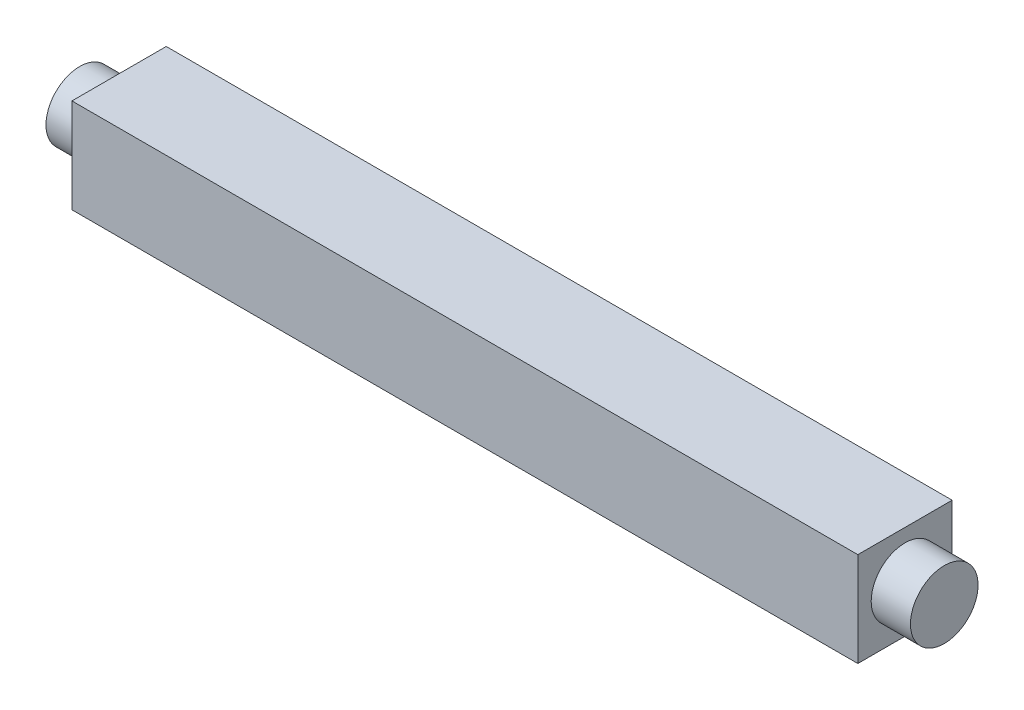
ISO-10303-21;
HEADER;
FILE_DESCRIPTION(('STEP AP214'),'2;1');
FILE_NAME('part.step','',(''),(''),'','','');
FILE_SCHEMA(('AUTOMOTIVE_DESIGN { 1 0 10303 214 1 1 1 1 }'));
ENDSEC;
DATA;
#1=APPLICATION_CONTEXT('core data for automotive mechanical design processes');
#2=APPLICATION_PROTOCOL_DEFINITION('international standard','automotive_design',2000,#1);
#3=PRODUCT_CONTEXT('',#1,'mechanical');
#4=PRODUCT('Part','Part','',(#3));
#5=PRODUCT_RELATED_PRODUCT_CATEGORY('part','',(#4));
#6=PRODUCT_DEFINITION_FORMATION('','',#4);
#7=PRODUCT_DEFINITION_CONTEXT('part definition',#1,'design');
#8=PRODUCT_DEFINITION('design','',#6,#7);
#9=PRODUCT_DEFINITION_SHAPE('','',#8);
#10=(LENGTH_UNIT() NAMED_UNIT(*) SI_UNIT(.MILLI.,.METRE.));
#11=(NAMED_UNIT(*) PLANE_ANGLE_UNIT() SI_UNIT($,.RADIAN.));
#12=(NAMED_UNIT(*) SI_UNIT($,.STERADIAN.) SOLID_ANGLE_UNIT());
#13=UNCERTAINTY_MEASURE_WITH_UNIT(LENGTH_MEASURE(1.E-05),#10,'distance_accuracy_value','');
#14=(GEOMETRIC_REPRESENTATION_CONTEXT(3) GLOBAL_UNCERTAINTY_ASSIGNED_CONTEXT((#13)) GLOBAL_UNIT_ASSIGNED_CONTEXT((#10,
#11,#12)) REPRESENTATION_CONTEXT('',''));
#15=CARTESIAN_POINT('',(0.,0.,0.));
#16=DIRECTION('',(0.,0.,1.));
#17=DIRECTION('',(1.,0.,0.));
#18=AXIS2_PLACEMENT_3D('',#15,#16,#17);
#19=CARTESIAN_POINT('',(0.,0.,6.));
#20=DIRECTION('',(1.,0.,0.));
#21=DIRECTION('',(0.,0.,-1.));
#22=AXIS2_PLACEMENT_3D('',#19,#20,#21);
#23=PLANE('',#22);
#24=CARTESIAN_POINT('',(0.,3.,3.));
#25=DIRECTION('',(-1.,0.,0.));
#26=DIRECTION('',(0.,0.,1.));
#27=AXIS2_PLACEMENT_3D('',#24,#25,#26);
#28=CIRCLE('',#27,2.15);
#29=CARTESIAN_POINT('',(0.,3.,5.15));
#30=VERTEX_POINT('',#29);
#31=EDGE_CURVE('E11',#30,#30,#28,.T.);
#32=ORIENTED_EDGE('',*,*,#31,.F.);
#33=EDGE_LOOP('',(#32));
#34=FACE_BOUND('',#33,.T.);
#35=DIRECTION('',(0.,-1.,0.));
#36=VECTOR('',#35,1.);
#37=CARTESIAN_POINT('',(0.,0.,0.));
#38=LINE('',#37,#36);
#39=CARTESIAN_POINT('',(0.,6.,0.));
#40=VERTEX_POINT('',#39);
#41=CARTESIAN_POINT('',(0.,0.,0.));
#42=VERTEX_POINT('',#41);
#43=EDGE_CURVE('E110',#40,#42,#38,.T.);
#44=ORIENTED_EDGE('',*,*,#43,.T.);
#45=DIRECTION('',(0.,0.,-1.));
#46=VECTOR('',#45,1.);
#47=CARTESIAN_POINT('',(0.,0.,6.));
#48=LINE('',#47,#46);
#49=CARTESIAN_POINT('',(0.,0.,6.));
#50=VERTEX_POINT('',#49);
#51=EDGE_CURVE('E42',#50,#42,#48,.T.);
#52=ORIENTED_EDGE('',*,*,#51,.F.);
#53=DIRECTION('',(0.,-1.,0.));
#54=VECTOR('',#53,1.);
#55=CARTESIAN_POINT('',(0.,0.,6.));
#56=LINE('',#55,#54);
#57=CARTESIAN_POINT('',(0.,6.,6.));
#58=VERTEX_POINT('',#57);
#59=EDGE_CURVE('E93',#58,#50,#56,.T.);
#60=ORIENTED_EDGE('',*,*,#59,.F.);
#61=DIRECTION('',(0.,0.,-1.));
#62=VECTOR('',#61,1.);
#63=CARTESIAN_POINT('',(0.,6.,6.));
#64=LINE('',#63,#62);
#65=EDGE_CURVE('E106',#58,#40,#64,.T.);
#66=ORIENTED_EDGE('',*,*,#65,.T.);
#67=EDGE_LOOP('',(#44,#52,#60,#66));
#68=FACE_BOUND('',#67,.T.);
#69=ADVANCED_FACE('F39',(#34,#68),#23,.F.);
#70=CARTESIAN_POINT('',(0.,0.,6.));
#71=DIRECTION('',(0.,1.,0.));
#72=DIRECTION('',(0.,0.,1.));
#73=AXIS2_PLACEMENT_3D('',#70,#71,#72);
#74=PLANE('',#73);
#75=DIRECTION('',(1.,0.,0.));
#76=VECTOR('',#75,1.);
#77=CARTESIAN_POINT('',(0.,0.,0.));
#78=LINE('',#77,#76);
#79=CARTESIAN_POINT('',(50.,0.,0.));
#80=VERTEX_POINT('',#79);
#81=EDGE_CURVE('E99',#42,#80,#78,.T.);
#82=ORIENTED_EDGE('',*,*,#81,.T.);
#83=DIRECTION('',(0.,0.,-1.));
#84=VECTOR('',#83,1.);
#85=CARTESIAN_POINT('',(50.,0.,6.));
#86=LINE('',#85,#84);
#87=CARTESIAN_POINT('',(50.,0.,6.));
#88=VERTEX_POINT('',#87);
#89=EDGE_CURVE('E97',#88,#80,#86,.T.);
#90=ORIENTED_EDGE('',*,*,#89,.F.);
#91=DIRECTION('',(1.,0.,0.));
#92=VECTOR('',#91,1.);
#93=CARTESIAN_POINT('',(0.,0.,6.));
#94=LINE('',#93,#92);
#95=EDGE_CURVE('E88',#50,#88,#94,.T.);
#96=ORIENTED_EDGE('',*,*,#95,.F.);
#97=ORIENTED_EDGE('',*,*,#51,.T.);
#98=EDGE_LOOP('',(#82,#90,#96,#97));
#99=FACE_BOUND('',#98,.T.);
#100=ADVANCED_FACE('F98',(#99),#74,.F.);
#101=CARTESIAN_POINT('',(50.,0.,6.));
#102=DIRECTION('',(-1.,0.,0.));
#103=DIRECTION('',(0.,0.,1.));
#104=AXIS2_PLACEMENT_3D('',#101,#102,#103);
#105=PLANE('',#104);
#106=CARTESIAN_POINT('',(50.,3.,3.));
#107=DIRECTION('',(-1.,0.,0.));
#108=DIRECTION('',(0.,0.,1.));
#109=AXIS2_PLACEMENT_3D('',#106,#107,#108);
#110=CIRCLE('',#109,2.15);
#111=CARTESIAN_POINT('',(50.,3.,5.15));
#112=VERTEX_POINT('',#111);
#113=EDGE_CURVE('E134',#112,#112,#110,.T.);
#114=ORIENTED_EDGE('',*,*,#113,.T.);
#115=EDGE_LOOP('',(#114));
#116=FACE_BOUND('',#115,.T.);
#117=DIRECTION('',(0.,1.,0.));
#118=VECTOR('',#117,1.);
#119=CARTESIAN_POINT('',(50.,0.,0.));
#120=LINE('',#119,#118);
#121=CARTESIAN_POINT('',(50.,6.,0.));
#122=VERTEX_POINT('',#121);
#123=EDGE_CURVE('E74',#80,#122,#120,.T.);
#124=ORIENTED_EDGE('',*,*,#123,.T.);
#125=DIRECTION('',(0.,0.,-1.));
#126=VECTOR('',#125,1.);
#127=CARTESIAN_POINT('',(50.,6.,6.));
#128=LINE('',#127,#126);
#129=CARTESIAN_POINT('',(50.,6.,6.));
#130=VERTEX_POINT('',#129);
#131=EDGE_CURVE('E101',#130,#122,#128,.T.);
#132=ORIENTED_EDGE('',*,*,#131,.F.);
#133=DIRECTION('',(0.,1.,0.));
#134=VECTOR('',#133,1.);
#135=CARTESIAN_POINT('',(50.,0.,6.));
#136=LINE('',#135,#134);
#137=EDGE_CURVE('E91',#88,#130,#136,.T.);
#138=ORIENTED_EDGE('',*,*,#137,.F.);
#139=ORIENTED_EDGE('',*,*,#89,.T.);
#140=EDGE_LOOP('',(#124,#132,#138,#139));
#141=FACE_BOUND('',#140,.T.);
#142=ADVANCED_FACE('F102',(#116,#141),#105,.F.);
#143=CARTESIAN_POINT('',(0.,6.,6.));
#144=DIRECTION('',(0.,-1.,0.));
#145=DIRECTION('',(0.,0.,-1.));
#146=AXIS2_PLACEMENT_3D('',#143,#144,#145);
#147=PLANE('',#146);
#148=DIRECTION('',(-1.,0.,0.));
#149=VECTOR('',#148,1.);
#150=CARTESIAN_POINT('',(0.,6.,0.));
#151=LINE('',#150,#149);
#152=EDGE_CURVE('E80',#122,#40,#151,.T.);
#153=ORIENTED_EDGE('',*,*,#152,.T.);
#154=ORIENTED_EDGE('',*,*,#65,.F.);
#155=DIRECTION('',(-1.,0.,0.));
#156=VECTOR('',#155,1.);
#157=CARTESIAN_POINT('',(0.,6.,6.));
#158=LINE('',#157,#156);
#159=EDGE_CURVE('E57',#130,#58,#158,.T.);
#160=ORIENTED_EDGE('',*,*,#159,.F.);
#161=ORIENTED_EDGE('',*,*,#131,.T.);
#162=EDGE_LOOP('',(#153,#154,#160,#161));
#163=FACE_BOUND('',#162,.T.);
#164=ADVANCED_FACE('F124',(#163),#147,.F.);
#165=CARTESIAN_POINT('',(0.,0.,6.));
#166=DIRECTION('',(0.,0.,-1.));
#167=DIRECTION('',(-1.,0.,0.));
#168=AXIS2_PLACEMENT_3D('',#165,#166,#167);
#169=PLANE('',#168);
#170=ORIENTED_EDGE('',*,*,#59,.T.);
#171=ORIENTED_EDGE('',*,*,#95,.T.);
#172=ORIENTED_EDGE('',*,*,#137,.T.);
#173=ORIENTED_EDGE('',*,*,#159,.T.);
#174=EDGE_LOOP('',(#170,#171,#172,#173));
#175=FACE_BOUND('',#174,.T.);
#176=ADVANCED_FACE('F89',(#175),#169,.F.);
#177=CARTESIAN_POINT('',(0.,0.,0.));
#178=DIRECTION('',(0.,0.,-1.));
#179=DIRECTION('',(-1.,0.,0.));
#180=AXIS2_PLACEMENT_3D('',#177,#178,#179);
#181=PLANE('',#180);
#182=ORIENTED_EDGE('',*,*,#43,.F.);
#183=ORIENTED_EDGE('',*,*,#152,.F.);
#184=ORIENTED_EDGE('',*,*,#123,.F.);
#185=ORIENTED_EDGE('',*,*,#81,.F.);
#186=EDGE_LOOP('',(#182,#183,#184,#185));
#187=FACE_BOUND('',#186,.T.);
#188=ADVANCED_FACE('F127',(#187),#181,.T.);
#189=CARTESIAN_POINT('',(-2.5,3.,3.));
#190=DIRECTION('',(1.,0.,0.));
#191=DIRECTION('',(0.,0.,-1.));
#192=AXIS2_PLACEMENT_3D('',#189,#190,#191);
#193=CYLINDRICAL_SURFACE('',#192,2.15);
#194=CARTESIAN_POINT('',(-2.5,3.,3.));
#195=DIRECTION('',(-1.,0.,0.));
#196=DIRECTION('',(0.,0.,1.));
#197=AXIS2_PLACEMENT_3D('',#194,#195,#196);
#198=CIRCLE('',#197,2.15);
#199=CARTESIAN_POINT('',(-2.5,3.,5.15));
#200=VERTEX_POINT('',#199);
#201=EDGE_CURVE('E114',#200,#200,#198,.T.);
#202=ORIENTED_EDGE('',*,*,#201,.F.);
#203=EDGE_LOOP('',(#202));
#204=FACE_BOUND('',#203,.T.);
#205=ORIENTED_EDGE('',*,*,#31,.T.);
#206=EDGE_LOOP('',(#205));
#207=FACE_BOUND('',#206,.T.);
#208=ADVANCED_FACE('F163',(#204,#207),#193,.T.);
#209=CARTESIAN_POINT('',(-2.5,3.,3.));
#210=DIRECTION('',(-1.,0.,0.));
#211=DIRECTION('',(0.,0.,1.));
#212=AXIS2_PLACEMENT_3D('',#209,#210,#211);
#213=PLANE('',#212);
#214=ORIENTED_EDGE('',*,*,#201,.T.);
#215=EDGE_LOOP('',(#214));
#216=FACE_BOUND('',#215,.T.);
#217=ADVANCED_FACE('F148',(#216),#213,.T.);
#218=CARTESIAN_POINT('',(50.,3.,3.));
#219=DIRECTION('',(1.,0.,0.));
#220=DIRECTION('',(0.,0.,-1.));
#221=AXIS2_PLACEMENT_3D('',#218,#219,#220);
#222=CYLINDRICAL_SURFACE('',#221,2.15);
#223=ORIENTED_EDGE('',*,*,#113,.F.);
#224=EDGE_LOOP('',(#223));
#225=FACE_BOUND('',#224,.T.);
#226=CARTESIAN_POINT('',(52.5,3.,3.));
#227=DIRECTION('',(-1.,0.,0.));
#228=DIRECTION('',(0.,0.,1.));
#229=AXIS2_PLACEMENT_3D('',#226,#227,#228);
#230=CIRCLE('',#229,2.15);
#231=CARTESIAN_POINT('',(52.5,3.,5.15));
#232=VERTEX_POINT('',#231);
#233=EDGE_CURVE('E135',#232,#232,#230,.T.);
#234=ORIENTED_EDGE('',*,*,#233,.T.);
#235=EDGE_LOOP('',(#234));
#236=FACE_BOUND('',#235,.T.);
#237=ADVANCED_FACE('F144',(#225,#236),#222,.T.);
#238=CARTESIAN_POINT('',(52.5,3.,3.));
#239=DIRECTION('',(-1.,0.,0.));
#240=DIRECTION('',(0.,0.,1.));
#241=AXIS2_PLACEMENT_3D('',#238,#239,#240);
#242=PLANE('',#241);
#243=ORIENTED_EDGE('',*,*,#233,.F.);
#244=EDGE_LOOP('',(#243));
#245=FACE_BOUND('',#244,.T.);
#246=ADVANCED_FACE('F147',(#245),#242,.F.);
#247=CLOSED_SHELL('',(#69,#100,#142,#164,#176,#188,#208,#217,#237,#246));
#248=MANIFOLD_SOLID_BREP('B2',#247);
#249=ADVANCED_BREP_SHAPE_REPRESENTATION('',(#18,#248),#14);
#250=SHAPE_DEFINITION_REPRESENTATION(#9,#249);
ENDSEC;
END-ISO-10303-21;
